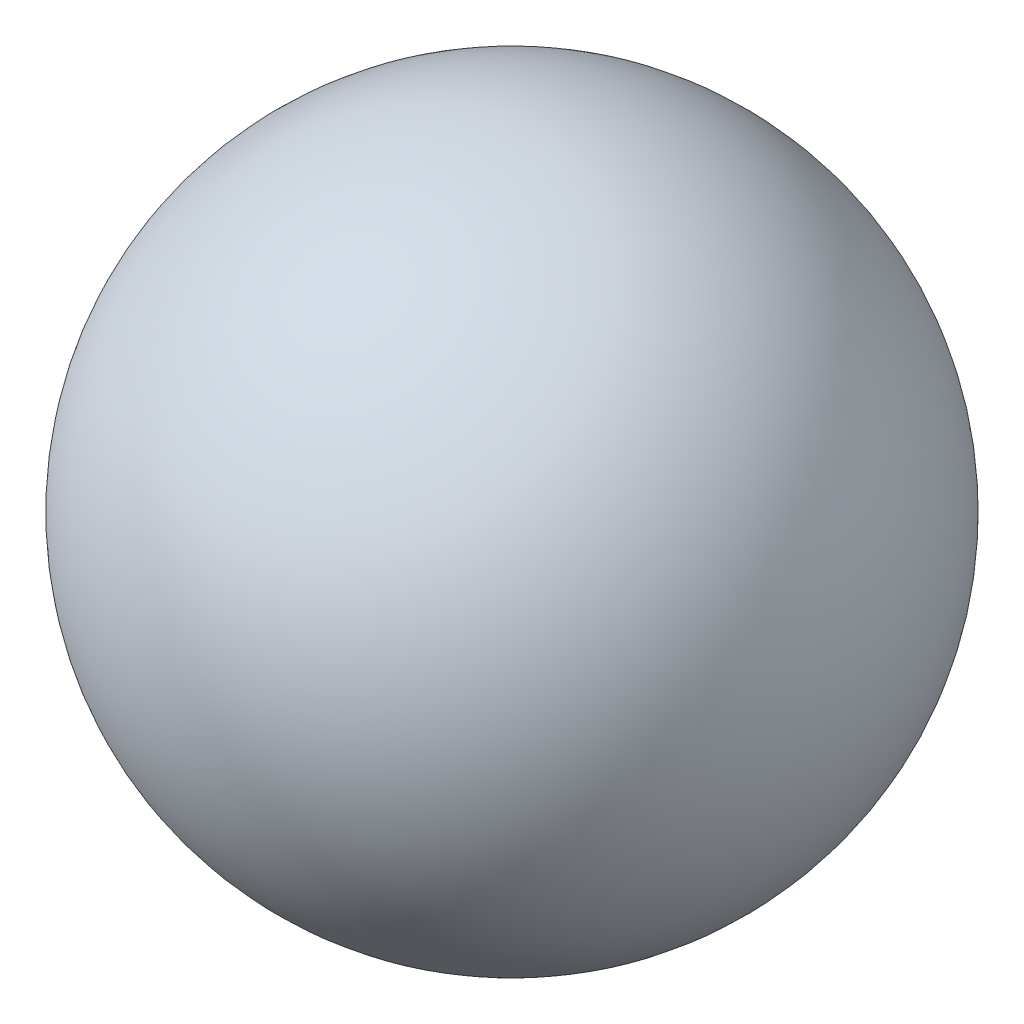
ISO-10303-21;
HEADER;
FILE_DESCRIPTION(('STEP AP214'),'2;1');
FILE_NAME('part.step','',(''),(''),'','','');
FILE_SCHEMA(('AUTOMOTIVE_DESIGN { 1 0 10303 214 1 1 1 1 }'));
ENDSEC;
DATA;
#1=APPLICATION_CONTEXT('core data for automotive mechanical design processes');
#2=APPLICATION_PROTOCOL_DEFINITION('international standard','automotive_design',2000,#1);
#3=PRODUCT_CONTEXT('',#1,'mechanical');
#4=PRODUCT('Part','Part','',(#3));
#5=PRODUCT_RELATED_PRODUCT_CATEGORY('part','',(#4));
#6=PRODUCT_DEFINITION_FORMATION('','',#4);
#7=PRODUCT_DEFINITION_CONTEXT('part definition',#1,'design');
#8=PRODUCT_DEFINITION('design','',#6,#7);
#9=PRODUCT_DEFINITION_SHAPE('','',#8);
#10=(LENGTH_UNIT() NAMED_UNIT(*) SI_UNIT(.MILLI.,.METRE.));
#11=(NAMED_UNIT(*) PLANE_ANGLE_UNIT() SI_UNIT($,.RADIAN.));
#12=(NAMED_UNIT(*) SI_UNIT($,.STERADIAN.) SOLID_ANGLE_UNIT());
#13=UNCERTAINTY_MEASURE_WITH_UNIT(LENGTH_MEASURE(1.E-05),#10,'distance_accuracy_value','');
#14=(GEOMETRIC_REPRESENTATION_CONTEXT(3) GLOBAL_UNCERTAINTY_ASSIGNED_CONTEXT((#13)) GLOBAL_UNIT_ASSIGNED_CONTEXT((#10,
#11,#12)) REPRESENTATION_CONTEXT('',''));
#15=CARTESIAN_POINT('',(0.,0.,0.));
#16=DIRECTION('',(0.,0.,1.));
#17=DIRECTION('',(1.,0.,0.));
#18=AXIS2_PLACEMENT_3D('',#15,#16,#17);
#19=CARTESIAN_POINT('',(0.,0.,0.));
#20=DIRECTION('',(0.,-1.,0.));
#21=DIRECTION('',(-1.,0.,0.));
#22=AXIS2_PLACEMENT_3D('',#19,#20,#21);
#23=SPHERICAL_SURFACE('',#22,2.78);
#24=CARTESIAN_POINT('',(1.46478714042348E-13,-2.78,0.));
#25=VERTEX_POINT('',#24);
#26=VERTEX_LOOP('',#25);
#27=FACE_BOUND('',#26,.T.);
#28=ADVANCED_FACE('F28',(#27),#23,.T.);
#29=CLOSED_SHELL('',(#28));
#30=MANIFOLD_SOLID_BREP('B2',#29);
#31=ADVANCED_BREP_SHAPE_REPRESENTATION('',(#18,#30),#14);
#32=SHAPE_DEFINITION_REPRESENTATION(#9,#31);
ENDSEC;
END-ISO-10303-21;
